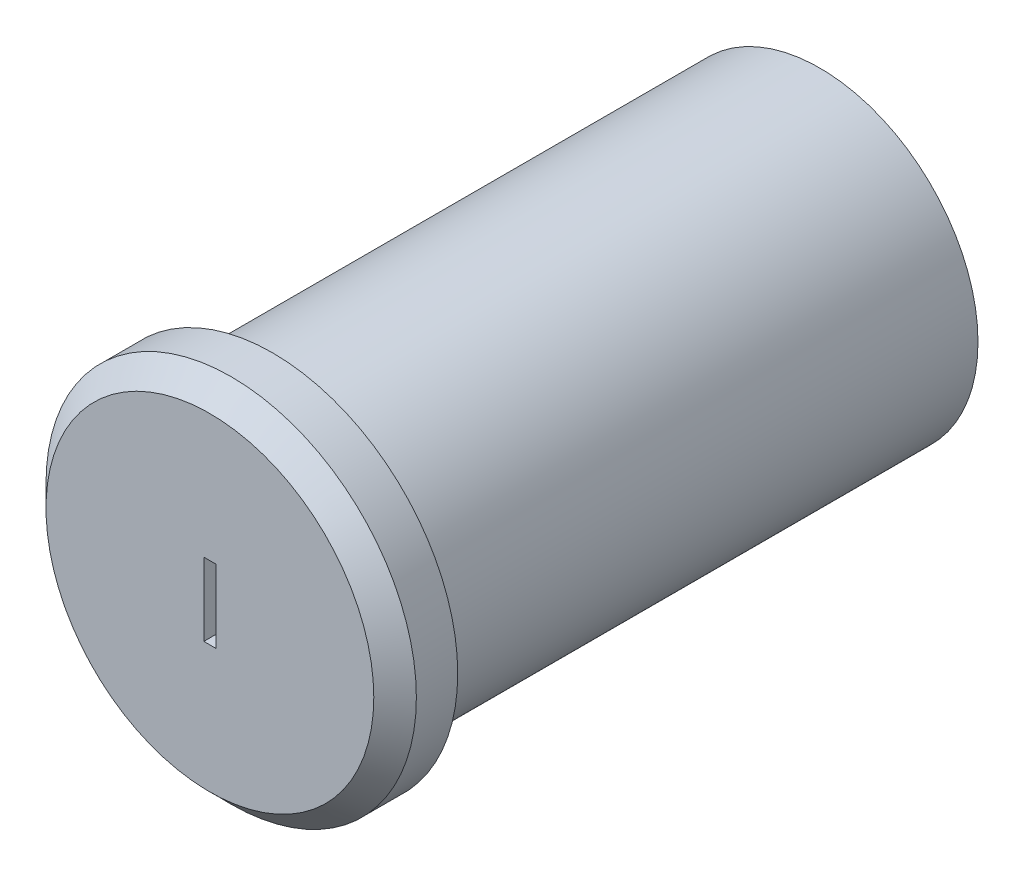
ISO-10303-21;
HEADER;
FILE_DESCRIPTION(('STEP AP214'),'2;1');
FILE_NAME('part.step','',(''),(''),'','','');
FILE_SCHEMA(('AUTOMOTIVE_DESIGN { 1 0 10303 214 1 1 1 1 }'));
ENDSEC;
DATA;
#1=APPLICATION_CONTEXT('core data for automotive mechanical design processes');
#2=APPLICATION_PROTOCOL_DEFINITION('international standard','automotive_design',2000,#1);
#3=PRODUCT_CONTEXT('',#1,'mechanical');
#4=PRODUCT('Part','Part','',(#3));
#5=PRODUCT_RELATED_PRODUCT_CATEGORY('part','',(#4));
#6=PRODUCT_DEFINITION_FORMATION('','',#4);
#7=PRODUCT_DEFINITION_CONTEXT('part definition',#1,'design');
#8=PRODUCT_DEFINITION('design','',#6,#7);
#9=PRODUCT_DEFINITION_SHAPE('','',#8);
#10=(LENGTH_UNIT() NAMED_UNIT(*) SI_UNIT(.MILLI.,.METRE.));
#11=(NAMED_UNIT(*) PLANE_ANGLE_UNIT() SI_UNIT($,.RADIAN.));
#12=(NAMED_UNIT(*) SI_UNIT($,.STERADIAN.) SOLID_ANGLE_UNIT());
#13=UNCERTAINTY_MEASURE_WITH_UNIT(LENGTH_MEASURE(1.E-05),#10,'distance_accuracy_value','');
#14=(GEOMETRIC_REPRESENTATION_CONTEXT(3) GLOBAL_UNCERTAINTY_ASSIGNED_CONTEXT((#13)) GLOBAL_UNIT_ASSIGNED_CONTEXT((#10,
#11,#12)) REPRESENTATION_CONTEXT('',''));
#15=CARTESIAN_POINT('',(0.,0.,0.));
#16=DIRECTION('',(0.,0.,1.));
#17=DIRECTION('',(1.,0.,0.));
#18=AXIS2_PLACEMENT_3D('',#15,#16,#17);
#19=CARTESIAN_POINT('',(0.,0.,-45.));
#20=DIRECTION('',(0.,0.,1.));
#21=DIRECTION('',(1.,0.,0.));
#22=AXIS2_PLACEMENT_3D('',#19,#20,#21);
#23=CYLINDRICAL_SURFACE('',#22,13.);
#24=CARTESIAN_POINT('',(0.,0.,-45.));
#25=DIRECTION('',(0.,0.,1.));
#26=DIRECTION('',(1.,0.,0.));
#27=AXIS2_PLACEMENT_3D('',#24,#25,#26);
#28=CIRCLE('',#27,13.);
#29=CARTESIAN_POINT('',(13.,0.,-45.));
#30=VERTEX_POINT('',#29);
#31=EDGE_CURVE('E11',#30,#30,#28,.T.);
#32=CARTESIAN_POINT('',(0.,0.,0.));
#33=DIRECTION('',(0.,0.,1.));
#34=DIRECTION('',(1.,0.,0.));
#35=AXIS2_PLACEMENT_3D('',#32,#33,#34);
#36=CIRCLE('',#35,13.);
#37=CARTESIAN_POINT('',(13.,0.,0.));
#38=VERTEX_POINT('',#37);
#39=EDGE_CURVE('E45',#38,#38,#36,.T.);
#40=CARTESIAN_POINT('',(13.,0.,-45.));
#41=CARTESIAN_POINT('',(13.,0.,-44.53125));
#42=CARTESIAN_POINT('',(13.,0.,-44.0625));
#43=CARTESIAN_POINT('',(13.,0.,-43.125));
#44=CARTESIAN_POINT('',(13.,0.,-42.65625));
#45=CARTESIAN_POINT('',(13.,0.,-41.71875));
#46=CARTESIAN_POINT('',(13.,0.,-41.25));
#47=CARTESIAN_POINT('',(13.,0.,-40.3125));
#48=CARTESIAN_POINT('',(13.,0.,-39.84375));
#49=CARTESIAN_POINT('',(13.,0.,-38.90625));
#50=CARTESIAN_POINT('',(13.,0.,-38.4375));
#51=CARTESIAN_POINT('',(13.,0.,-37.5));
#52=CARTESIAN_POINT('',(13.,0.,-37.03125));
#53=CARTESIAN_POINT('',(13.,0.,-36.09375));
#54=CARTESIAN_POINT('',(13.,0.,-35.625));
#55=CARTESIAN_POINT('',(13.,0.,-34.6875));
#56=CARTESIAN_POINT('',(13.,0.,-34.21875));
#57=CARTESIAN_POINT('',(13.,0.,-33.28125));
#58=CARTESIAN_POINT('',(13.,0.,-32.8125));
#59=CARTESIAN_POINT('',(13.,0.,-31.875));
#60=CARTESIAN_POINT('',(13.,0.,-31.40625));
#61=CARTESIAN_POINT('',(13.,0.,-30.46875));
#62=CARTESIAN_POINT('',(13.,0.,-30.));
#63=CARTESIAN_POINT('',(13.,0.,-29.0625));
#64=CARTESIAN_POINT('',(13.,0.,-28.59375));
#65=CARTESIAN_POINT('',(13.,0.,-27.65625));
#66=CARTESIAN_POINT('',(13.,0.,-27.1875));
#67=CARTESIAN_POINT('',(13.,0.,-26.25));
#68=CARTESIAN_POINT('',(13.,0.,-25.78125));
#69=CARTESIAN_POINT('',(13.,0.,-24.84375));
#70=CARTESIAN_POINT('',(13.,0.,-24.375));
#71=CARTESIAN_POINT('',(13.,0.,-23.4375));
#72=CARTESIAN_POINT('',(13.,0.,-22.96875));
#73=CARTESIAN_POINT('',(13.,0.,-22.03125));
#74=CARTESIAN_POINT('',(13.,0.,-21.5625));
#75=CARTESIAN_POINT('',(13.,0.,-20.625));
#76=CARTESIAN_POINT('',(13.,0.,-20.15625));
#77=CARTESIAN_POINT('',(13.,0.,-19.21875));
#78=CARTESIAN_POINT('',(13.,0.,-18.75));
#79=CARTESIAN_POINT('',(13.,0.,-17.8125));
#80=CARTESIAN_POINT('',(13.,0.,-17.34375));
#81=CARTESIAN_POINT('',(13.,0.,-16.40625));
#82=CARTESIAN_POINT('',(13.,0.,-15.9375));
#83=CARTESIAN_POINT('',(13.,0.,-15.));
#84=CARTESIAN_POINT('',(13.,0.,-14.53125));
#85=CARTESIAN_POINT('',(13.,0.,-13.59375));
#86=CARTESIAN_POINT('',(13.,0.,-13.125));
#87=CARTESIAN_POINT('',(13.,0.,-12.1875));
#88=CARTESIAN_POINT('',(13.,0.,-11.71875));
#89=CARTESIAN_POINT('',(13.,0.,-10.78125));
#90=CARTESIAN_POINT('',(13.,0.,-10.3125));
#91=CARTESIAN_POINT('',(13.,0.,-9.37500000000001));
#92=CARTESIAN_POINT('',(13.,0.,-8.90625000000001));
#93=CARTESIAN_POINT('',(13.,0.,-7.96875000000001));
#94=CARTESIAN_POINT('',(13.,0.,-7.50000000000001));
#95=CARTESIAN_POINT('',(13.,0.,-6.56250000000001));
#96=CARTESIAN_POINT('',(13.,0.,-6.09375000000001));
#97=CARTESIAN_POINT('',(13.,0.,-5.15625000000001));
#98=CARTESIAN_POINT('',(13.,0.,-4.68750000000001));
#99=CARTESIAN_POINT('',(13.,0.,-3.75000000000001));
#100=CARTESIAN_POINT('',(13.,0.,-3.28125000000001));
#101=CARTESIAN_POINT('',(13.,0.,-2.34375000000001));
#102=CARTESIAN_POINT('',(13.,0.,-1.87500000000001));
#103=CARTESIAN_POINT('',(13.,0.,-0.937500000000006));
#104=CARTESIAN_POINT('',(13.,0.,-0.468750000000007));
#105=CARTESIAN_POINT('',(13.,0.,0.));
#106=B_SPLINE_CURVE_WITH_KNOTS('',3,(#40,#41,#42,#43,#44,#45,#46,#47,#48,#49,#50,#51,#52,#53,
#54,#55,#56,#57,#58,#59,#60,#61,#62,#63,#64,#65,#66,#67,#68,#69,#70,#71,#72,#73,#74,#75,#76,#77,
#78,#79,#80,#81,#82,#83,#84,#85,#86,#87,#88,#89,#90,#91,#92,#93,#94,#95,#96,#97,#98,#99,#100,
#101,#102,#103,#104,#105),.UNSPECIFIED.,.F.,.F.,(4,2,2,2,2,2,2,2,2,2,2,2,2,2,2,2,2,2,2,2,2,2,2,
2,2,2,2,2,2,2,2,2,4),(0.,1.40625,2.8125,4.21874999999999,5.625,7.03125,8.43749999999999,9.84375,
11.25,12.65625,14.0625,15.46875,16.875,18.28125,19.6875,21.09375,22.5,23.90625,25.3125,26.71875,
28.125,29.53125,30.9375,32.34375,33.75,35.15625,36.5625,37.96875,39.375,40.78125,42.1875,
43.59375,45.),.UNSPECIFIED.);
#107=EDGE_CURVE('BSEAM39',#30,#38,#106,.T.);
#108=ORIENTED_EDGE('',*,*,#31,.T.);
#109=ORIENTED_EDGE('',*,*,#39,.F.);
#110=ORIENTED_EDGE('',*,*,#107,.T.);
#111=ORIENTED_EDGE('',*,*,#107,.F.);
#112=EDGE_LOOP('',(#108,#110,#109,#111));
#113=FACE_BOUND('',#112,.T.);
#114=ADVANCED_FACE('F39',(#113),#23,.T.);
#115=CARTESIAN_POINT('',(0.,0.,-45.));
#116=DIRECTION('',(0.,0.,1.));
#117=DIRECTION('',(1.,0.,0.));
#118=AXIS2_PLACEMENT_3D('',#115,#116,#117);
#119=PLANE('',#118);
#120=ORIENTED_EDGE('',*,*,#31,.F.);
#121=EDGE_LOOP('',(#120));
#122=FACE_BOUND('',#121,.T.);
#123=ADVANCED_FACE('F137',(#122),#119,.F.);
#124=CARTESIAN_POINT('',(0.,0.,3.4));
#125=DIRECTION('',(0.,0.,-1.));
#126=DIRECTION('',(-1.,0.,0.));
#127=AXIS2_PLACEMENT_3D('',#124,#125,#126);
#128=CYLINDRICAL_SURFACE('',#127,15.225);
#129=CARTESIAN_POINT('',(0.,0.,3.4));
#130=DIRECTION('',(0.,0.,1.));
#131=DIRECTION('',(1.,0.,0.));
#132=AXIS2_PLACEMENT_3D('',#129,#130,#131);
#133=CIRCLE('',#132,15.225);
#134=CARTESIAN_POINT('',(15.225,0.,3.4));
#135=VERTEX_POINT('',#134);
#136=EDGE_CURVE('E119',#135,#135,#133,.T.);
#137=ORIENTED_EDGE('',*,*,#136,.F.);
#138=EDGE_LOOP('',(#137));
#139=FACE_BOUND('',#138,.T.);
#140=CARTESIAN_POINT('',(0.,0.,0.));
#141=DIRECTION('',(0.,0.,1.));
#142=DIRECTION('',(1.,0.,0.));
#143=AXIS2_PLACEMENT_3D('',#140,#141,#142);
#144=CIRCLE('',#143,15.225);
#145=CARTESIAN_POINT('',(15.225,0.,0.));
#146=VERTEX_POINT('',#145);
#147=EDGE_CURVE('E118',#146,#146,#144,.T.);
#148=ORIENTED_EDGE('',*,*,#147,.T.);
#149=EDGE_LOOP('',(#148));
#150=FACE_BOUND('',#149,.T.);
#151=ADVANCED_FACE('F129',(#139,#150),#128,.T.);
#152=CARTESIAN_POINT('',(0.,0.,0.));
#153=DIRECTION('',(0.,0.,1.));
#154=DIRECTION('',(1.,0.,0.));
#155=AXIS2_PLACEMENT_3D('',#152,#153,#154);
#156=PLANE('',#155);
#157=ORIENTED_EDGE('',*,*,#39,.T.);
#158=EDGE_LOOP('',(#157));
#159=FACE_BOUND('',#158,.T.);
#160=ORIENTED_EDGE('',*,*,#147,.F.);
#161=EDGE_LOOP('',(#160));
#162=FACE_BOUND('',#161,.T.);
#163=ADVANCED_FACE('F130',(#159,#162),#156,.F.);
#164=CARTESIAN_POINT('',(0.,0.,3.4));
#165=DIRECTION('',(0.,0.,-1.));
#166=DIRECTION('',(1.,0.,0.));
#167=AXIS2_PLACEMENT_3D('',#164,#165,#166);
#168=CONICAL_SURFACE('',#167,15.225,0.78539816339745);
#169=CARTESIAN_POINT('',(0.,0.,5.15));
#170=DIRECTION('',(0.,0.,1.));
#171=DIRECTION('',(1.,0.,0.));
#172=AXIS2_PLACEMENT_3D('',#169,#170,#171);
#173=CIRCLE('',#172,13.475);
#174=CARTESIAN_POINT('',(13.475,0.,5.15));
#175=VERTEX_POINT('',#174);
#176=EDGE_CURVE('E112',#175,#175,#173,.T.);
#177=ORIENTED_EDGE('',*,*,#176,.F.);
#178=EDGE_LOOP('',(#177));
#179=FACE_BOUND('',#178,.T.);
#180=ORIENTED_EDGE('',*,*,#136,.T.);
#181=EDGE_LOOP('',(#180));
#182=FACE_BOUND('',#181,.T.);
#183=ADVANCED_FACE('F127',(#179,#182),#168,.T.);
#184=CARTESIAN_POINT('',(0.,0.,5.15));
#185=DIRECTION('',(0.,0.,1.));
#186=DIRECTION('',(1.,0.,0.));
#187=AXIS2_PLACEMENT_3D('',#184,#185,#186);
#188=PLANE('',#187);
#189=DIRECTION('',(0.,1.,0.));
#190=VECTOR('',#189,1.);
#191=CARTESIAN_POINT('',(0.5,-3.,5.15));
#192=LINE('',#191,#190);
#193=CARTESIAN_POINT('',(0.5,-3.,5.15));
#194=VERTEX_POINT('',#193);
#195=CARTESIAN_POINT('',(0.5,3.,5.15));
#196=VERTEX_POINT('',#195);
#197=EDGE_CURVE('E52',#194,#196,#192,.T.);
#198=ORIENTED_EDGE('',*,*,#197,.F.);
#199=DIRECTION('',(1.,0.,0.));
#200=VECTOR('',#199,1.);
#201=CARTESIAN_POINT('',(-0.5,-3.,5.15));
#202=LINE('',#201,#200);
#203=CARTESIAN_POINT('',(-0.5,-3.,5.15));
#204=VERTEX_POINT('',#203);
#205=EDGE_CURVE('E104',#204,#194,#202,.T.);
#206=ORIENTED_EDGE('',*,*,#205,.F.);
#207=DIRECTION('',(0.,-1.,0.));
#208=VECTOR('',#207,1.);
#209=CARTESIAN_POINT('',(-0.5,-3.,5.15));
#210=LINE('',#209,#208);
#211=CARTESIAN_POINT('',(-0.5,3.,5.15));
#212=VERTEX_POINT('',#211);
#213=EDGE_CURVE('E109',#212,#204,#210,.T.);
#214=ORIENTED_EDGE('',*,*,#213,.F.);
#215=DIRECTION('',(-1.,0.,0.));
#216=VECTOR('',#215,1.);
#217=CARTESIAN_POINT('',(-0.5,3.,5.15));
#218=LINE('',#217,#216);
#219=EDGE_CURVE('E89',#196,#212,#218,.T.);
#220=ORIENTED_EDGE('',*,*,#219,.F.);
#221=EDGE_LOOP('',(#198,#206,#214,#220));
#222=FACE_BOUND('',#221,.T.);
#223=ORIENTED_EDGE('',*,*,#176,.T.);
#224=EDGE_LOOP('',(#223));
#225=FACE_BOUND('',#224,.T.);
#226=ADVANCED_FACE('F140',(#222,#225),#188,.T.);
#227=CARTESIAN_POINT('',(0.5,-3.,4.15));
#228=DIRECTION('',(1.,0.,0.));
#229=DIRECTION('',(0.,0.,-1.));
#230=AXIS2_PLACEMENT_3D('',#227,#228,#229);
#231=PLANE('',#230);
#232=ORIENTED_EDGE('',*,*,#197,.T.);
#233=DIRECTION('',(0.,0.,1.));
#234=VECTOR('',#233,1.);
#235=CARTESIAN_POINT('',(0.5,3.,4.15));
#236=LINE('',#235,#234);
#237=CARTESIAN_POINT('',(0.5,3.,4.15));
#238=VERTEX_POINT('',#237);
#239=EDGE_CURVE('E77',#238,#196,#236,.T.);
#240=ORIENTED_EDGE('',*,*,#239,.F.);
#241=DIRECTION('',(0.,1.,0.));
#242=VECTOR('',#241,1.);
#243=CARTESIAN_POINT('',(0.5,-3.,4.15));
#244=LINE('',#243,#242);
#245=CARTESIAN_POINT('',(0.5,-3.,4.15));
#246=VERTEX_POINT('',#245);
#247=EDGE_CURVE('E105',#246,#238,#244,.T.);
#248=ORIENTED_EDGE('',*,*,#247,.F.);
#249=DIRECTION('',(0.,0.,1.));
#250=VECTOR('',#249,1.);
#251=CARTESIAN_POINT('',(0.5,-3.,4.15));
#252=LINE('',#251,#250);
#253=EDGE_CURVE('E64',#246,#194,#252,.T.);
#254=ORIENTED_EDGE('',*,*,#253,.T.);
#255=EDGE_LOOP('',(#232,#240,#248,#254));
#256=FACE_BOUND('',#255,.T.);
#257=ADVANCED_FACE('F179',(#256),#231,.F.);
#258=CARTESIAN_POINT('',(-0.5,-3.,4.15));
#259=DIRECTION('',(0.,-1.,0.));
#260=DIRECTION('',(0.,0.,-1.));
#261=AXIS2_PLACEMENT_3D('',#258,#259,#260);
#262=PLANE('',#261);
#263=ORIENTED_EDGE('',*,*,#205,.T.);
#264=ORIENTED_EDGE('',*,*,#253,.F.);
#265=DIRECTION('',(1.,0.,0.));
#266=VECTOR('',#265,1.);
#267=CARTESIAN_POINT('',(-0.5,-3.,4.15));
#268=LINE('',#267,#266);
#269=CARTESIAN_POINT('',(-0.5,-3.,4.15));
#270=VERTEX_POINT('',#269);
#271=EDGE_CURVE('E100',#270,#246,#268,.T.);
#272=ORIENTED_EDGE('',*,*,#271,.F.);
#273=DIRECTION('',(0.,0.,1.));
#274=VECTOR('',#273,1.);
#275=CARTESIAN_POINT('',(-0.5,-3.,4.15));
#276=LINE('',#275,#274);
#277=EDGE_CURVE('E94',#270,#204,#276,.T.);
#278=ORIENTED_EDGE('',*,*,#277,.T.);
#279=EDGE_LOOP('',(#263,#264,#272,#278));
#280=FACE_BOUND('',#279,.T.);
#281=ADVANCED_FACE('F188',(#280),#262,.F.);
#282=CARTESIAN_POINT('',(-0.5,-3.,4.15));
#283=DIRECTION('',(-1.,0.,0.));
#284=DIRECTION('',(0.,0.,1.));
#285=AXIS2_PLACEMENT_3D('',#282,#283,#284);
#286=PLANE('',#285);
#287=ORIENTED_EDGE('',*,*,#213,.T.);
#288=ORIENTED_EDGE('',*,*,#277,.F.);
#289=DIRECTION('',(0.,-1.,0.));
#290=VECTOR('',#289,1.);
#291=CARTESIAN_POINT('',(-0.5,-3.,4.15));
#292=LINE('',#291,#290);
#293=CARTESIAN_POINT('',(-0.5,3.,4.15));
#294=VERTEX_POINT('',#293);
#295=EDGE_CURVE('E91',#294,#270,#292,.T.);
#296=ORIENTED_EDGE('',*,*,#295,.F.);
#297=DIRECTION('',(0.,0.,1.));
#298=VECTOR('',#297,1.);
#299=CARTESIAN_POINT('',(-0.5,3.,4.15));
#300=LINE('',#299,#298);
#301=EDGE_CURVE('E84',#294,#212,#300,.T.);
#302=ORIENTED_EDGE('',*,*,#301,.T.);
#303=EDGE_LOOP('',(#287,#288,#296,#302));
#304=FACE_BOUND('',#303,.T.);
#305=ADVANCED_FACE('F98',(#304),#286,.F.);
#306=CARTESIAN_POINT('',(-0.5,3.,4.15));
#307=DIRECTION('',(0.,1.,0.));
#308=DIRECTION('',(0.,0.,1.));
#309=AXIS2_PLACEMENT_3D('',#306,#307,#308);
#310=PLANE('',#309);
#311=ORIENTED_EDGE('',*,*,#219,.T.);
#312=ORIENTED_EDGE('',*,*,#301,.F.);
#313=DIRECTION('',(-1.,0.,0.));
#314=VECTOR('',#313,1.);
#315=CARTESIAN_POINT('',(-0.5,3.,4.15));
#316=LINE('',#315,#314);
#317=EDGE_CURVE('E82',#238,#294,#316,.T.);
#318=ORIENTED_EDGE('',*,*,#317,.F.);
#319=ORIENTED_EDGE('',*,*,#239,.T.);
#320=EDGE_LOOP('',(#311,#312,#318,#319));
#321=FACE_BOUND('',#320,.T.);
#322=ADVANCED_FACE('F85',(#321),#310,.F.);
#323=CARTESIAN_POINT('',(0.,0.,4.15));
#324=DIRECTION('',(0.,0.,-1.));
#325=DIRECTION('',(-1.,0.,0.));
#326=AXIS2_PLACEMENT_3D('',#323,#324,#325);
#327=PLANE('',#326);
#328=ORIENTED_EDGE('',*,*,#247,.T.);
#329=ORIENTED_EDGE('',*,*,#317,.T.);
#330=ORIENTED_EDGE('',*,*,#295,.T.);
#331=ORIENTED_EDGE('',*,*,#271,.T.);
#332=EDGE_LOOP('',(#328,#329,#330,#331));
#333=FACE_BOUND('',#332,.T.);
#334=ADVANCED_FACE('F103',(#333),#327,.F.);
#335=CLOSED_SHELL('',(#114,#123,#151,#163,#183,#226,#257,#281,#305,#322,#334));
#336=MANIFOLD_SOLID_BREP('B2',#335);
#337=ADVANCED_BREP_SHAPE_REPRESENTATION('',(#18,#336),#14);
#338=SHAPE_DEFINITION_REPRESENTATION(#9,#337);
ENDSEC;
END-ISO-10303-21;
